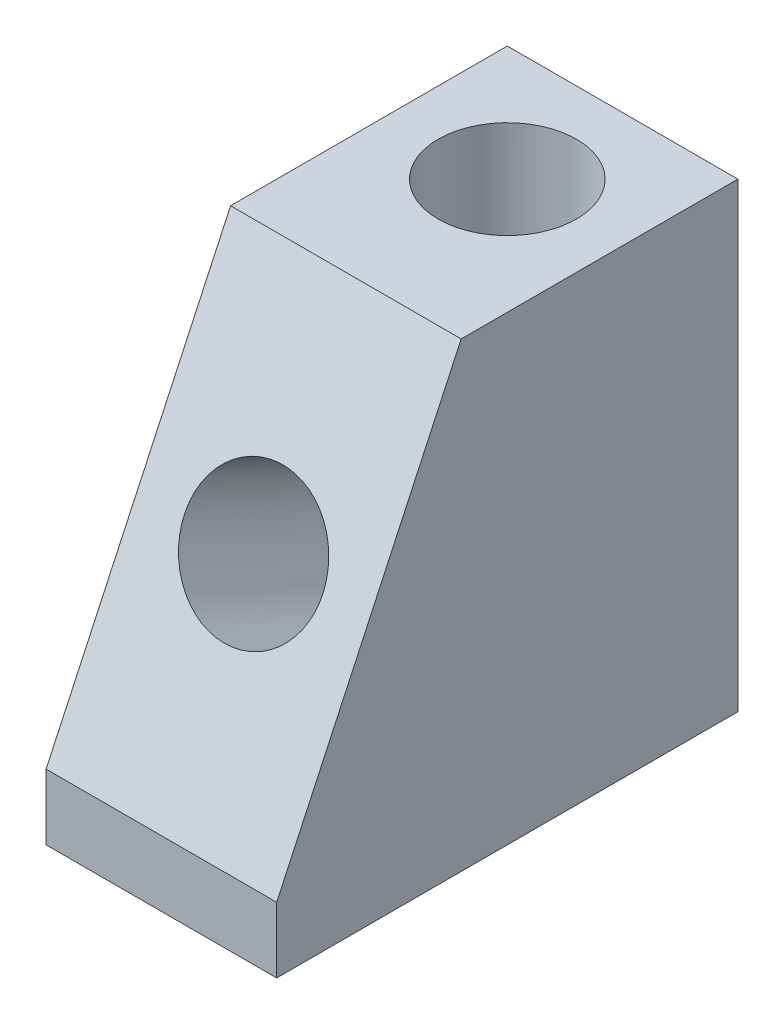
ISO-10303-21;
HEADER;
FILE_DESCRIPTION(('STEP AP214'),'2;1');
FILE_NAME('part.step','',(''),(''),'','','');
FILE_SCHEMA(('AUTOMOTIVE_DESIGN { 1 0 10303 214 1 1 1 1 }'));
ENDSEC;
DATA;
#1=APPLICATION_CONTEXT('core data for automotive mechanical design processes');
#2=APPLICATION_PROTOCOL_DEFINITION('international standard','automotive_design',2000,#1);
#3=PRODUCT_CONTEXT('',#1,'mechanical');
#4=PRODUCT('Part','Part','',(#3));
#5=PRODUCT_RELATED_PRODUCT_CATEGORY('part','',(#4));
#6=PRODUCT_DEFINITION_FORMATION('','',#4);
#7=PRODUCT_DEFINITION_CONTEXT('part definition',#1,'design');
#8=PRODUCT_DEFINITION('design','',#6,#7);
#9=PRODUCT_DEFINITION_SHAPE('','',#8);
#10=(LENGTH_UNIT() NAMED_UNIT(*) SI_UNIT(.MILLI.,.METRE.));
#11=(NAMED_UNIT(*) PLANE_ANGLE_UNIT() SI_UNIT($,.RADIAN.));
#12=(NAMED_UNIT(*) SI_UNIT($,.STERADIAN.) SOLID_ANGLE_UNIT());
#13=UNCERTAINTY_MEASURE_WITH_UNIT(LENGTH_MEASURE(1.E-05),#10,'distance_accuracy_value','');
#14=(GEOMETRIC_REPRESENTATION_CONTEXT(3) GLOBAL_UNCERTAINTY_ASSIGNED_CONTEXT((#13)) GLOBAL_UNIT_ASSIGNED_CONTEXT((#10,
#11,#12)) REPRESENTATION_CONTEXT('',''));
#15=CARTESIAN_POINT('',(0.,0.,0.));
#16=DIRECTION('',(0.,0.,1.));
#17=DIRECTION('',(1.,0.,0.));
#18=AXIS2_PLACEMENT_3D('',#15,#16,#17);
#19=CARTESIAN_POINT('',(2.5,10.,-7.5));
#20=DIRECTION('',(0.,-1.,0.));
#21=DIRECTION('',(0.,0.,-1.));
#22=AXIS2_PLACEMENT_3D('',#19,#20,#21);
#23=CYLINDRICAL_SURFACE('',#22,1.5);
#24=CARTESIAN_POINT('',(2.5,3.14629403912838,-7.5));
#25=DIRECTION('',(0.,-0.537299608346825,0.843391445812885));
#26=DIRECTION('',(0.,-0.843391445812885,-0.537299608346825));
#27=AXIS2_PLACEMENT_3D('',#24,#25,#26);
#28=ELLIPSE('',#27,2.79173849505536,1.5);
#29=CARTESIAN_POINT('',(1.,3.14629403912838,-7.5));
#30=VERTEX_POINT('',#29);
#31=CARTESIAN_POINT('',(4.,3.14629403912838,-7.5));
#32=VERTEX_POINT('',#31);
#33=EDGE_CURVE('E102',#30,#32,#28,.F.);
#34=ORIENTED_EDGE('',*,*,#33,.F.);
#35=CARTESIAN_POINT('',(2.5,3.14629403912838,-7.5));
#36=DIRECTION('',(0.,-0.843391445812885,-0.537299608346825));
#37=DIRECTION('',(0.,-0.537299608346825,0.843391445812885));
#38=AXIS2_PLACEMENT_3D('',#35,#36,#37);
#39=ELLIPSE('',#38,1.77853357115124,1.5);
#40=EDGE_CURVE('E60',#32,#30,#39,.F.);
#41=ORIENTED_EDGE('',*,*,#40,.F.);
#42=EDGE_LOOP('',(#34,#41));
#43=FACE_BOUND('',#42,.T.);
#44=CARTESIAN_POINT('',(2.5,10.,-7.5));
#45=DIRECTION('',(0.,1.,0.));
#46=DIRECTION('',(0.,0.,1.));
#47=AXIS2_PLACEMENT_3D('',#44,#45,#46);
#48=CIRCLE('',#47,1.5);
#49=CARTESIAN_POINT('',(2.5,10.,-6.));
#50=VERTEX_POINT('',#49);
#51=EDGE_CURVE('E140',#50,#50,#48,.T.);
#52=ORIENTED_EDGE('',*,*,#51,.T.);
#53=EDGE_LOOP('',(#52));
#54=FACE_BOUND('',#53,.T.);
#55=ADVANCED_FACE('F45',(#43,#54),#23,.F.);
#56=CARTESIAN_POINT('',(0.,10.,0.));
#57=DIRECTION('',(0.,-1.,0.));
#58=DIRECTION('',(0.,0.,-1.));
#59=AXIS2_PLACEMENT_3D('',#56,#57,#58);
#60=PLANE('',#59);
#61=DIRECTION('',(0.,0.,1.));
#62=VECTOR('',#61,1.);
#63=CARTESIAN_POINT('',(0.,10.,0.));
#64=LINE('',#63,#62);
#65=CARTESIAN_POINT('',(0.,10.,-10.));
#66=VERTEX_POINT('',#65);
#67=CARTESIAN_POINT('',(0.,10.,-4.));
#68=VERTEX_POINT('',#67);
#69=EDGE_CURVE('E148',#66,#68,#64,.T.);
#70=ORIENTED_EDGE('',*,*,#69,.T.);
#71=DIRECTION('',(1.,0.,0.));
#72=VECTOR('',#71,1.);
#73=CARTESIAN_POINT('',(0.,10.,-4.));
#74=LINE('',#73,#72);
#75=CARTESIAN_POINT('',(5.,10.,-4.));
#76=VERTEX_POINT('',#75);
#77=EDGE_CURVE('E133',#68,#76,#74,.T.);
#78=ORIENTED_EDGE('',*,*,#77,.T.);
#79=DIRECTION('',(0.,0.,-1.));
#80=VECTOR('',#79,1.);
#81=CARTESIAN_POINT('',(5.,10.,0.));
#82=LINE('',#81,#80);
#83=CARTESIAN_POINT('',(5.,10.,-10.));
#84=VERTEX_POINT('',#83);
#85=EDGE_CURVE('E152',#76,#84,#82,.T.);
#86=ORIENTED_EDGE('',*,*,#85,.T.);
#87=DIRECTION('',(-1.,0.,0.));
#88=VECTOR('',#87,1.);
#89=CARTESIAN_POINT('',(0.,10.,-10.));
#90=LINE('',#89,#88);
#91=EDGE_CURVE('E156',#84,#66,#90,.T.);
#92=ORIENTED_EDGE('',*,*,#91,.T.);
#93=EDGE_LOOP('',(#70,#78,#86,#92));
#94=FACE_BOUND('',#93,.T.);
#95=ORIENTED_EDGE('',*,*,#51,.F.);
#96=EDGE_LOOP('',(#95));
#97=FACE_BOUND('',#96,.T.);
#98=ADVANCED_FACE('F201',(#94,#97),#60,.F.);
#99=CARTESIAN_POINT('',(0.,0.,0.));
#100=DIRECTION('',(0.,-1.,0.));
#101=DIRECTION('',(0.,0.,-1.));
#102=AXIS2_PLACEMENT_3D('',#99,#100,#101);
#103=PLANE('',#102);
#104=DIRECTION('',(0.,0.,1.));
#105=VECTOR('',#104,1.);
#106=CARTESIAN_POINT('',(0.,0.,0.));
#107=LINE('',#106,#105);
#108=CARTESIAN_POINT('',(0.,0.,-10.));
#109=VERTEX_POINT('',#108);
#110=CARTESIAN_POINT('',(0.,0.,0.));
#111=VERTEX_POINT('',#110);
#112=EDGE_CURVE('E144',#109,#111,#107,.T.);
#113=ORIENTED_EDGE('',*,*,#112,.F.);
#114=DIRECTION('',(-1.,0.,0.));
#115=VECTOR('',#114,1.);
#116=CARTESIAN_POINT('',(0.,0.,-10.));
#117=LINE('',#116,#115);
#118=CARTESIAN_POINT('',(5.,0.,-10.));
#119=VERTEX_POINT('',#118);
#120=EDGE_CURVE('E153',#119,#109,#117,.T.);
#121=ORIENTED_EDGE('',*,*,#120,.F.);
#122=DIRECTION('',(0.,0.,-1.));
#123=VECTOR('',#122,1.);
#124=CARTESIAN_POINT('',(5.,0.,0.));
#125=LINE('',#124,#123);
#126=CARTESIAN_POINT('',(5.,0.,0.));
#127=VERTEX_POINT('',#126);
#128=EDGE_CURVE('E167',#127,#119,#125,.T.);
#129=ORIENTED_EDGE('',*,*,#128,.F.);
#130=DIRECTION('',(1.,0.,0.));
#131=VECTOR('',#130,1.);
#132=CARTESIAN_POINT('',(0.,0.,0.));
#133=LINE('',#132,#131);
#134=EDGE_CURVE('E163',#111,#127,#133,.T.);
#135=ORIENTED_EDGE('',*,*,#134,.F.);
#136=EDGE_LOOP('',(#113,#121,#129,#135));
#137=FACE_BOUND('',#136,.T.);
#138=CARTESIAN_POINT('',(2.5,0.,-7.5));
#139=DIRECTION('',(0.,1.,0.));
#140=DIRECTION('',(0.,0.,1.));
#141=AXIS2_PLACEMENT_3D('',#138,#139,#140);
#142=CIRCLE('',#141,1.5);
#143=CARTESIAN_POINT('',(2.5,0.,-6.));
#144=VERTEX_POINT('',#143);
#145=EDGE_CURVE('E137',#144,#144,#142,.T.);
#146=ORIENTED_EDGE('',*,*,#145,.T.);
#147=EDGE_LOOP('',(#146));
#148=FACE_BOUND('',#147,.T.);
#149=ADVANCED_FACE('F192',(#137,#148),#103,.T.);
#150=CARTESIAN_POINT('',(0.,10.,0.));
#151=DIRECTION('',(1.,0.,0.));
#152=DIRECTION('',(0.,0.,-1.));
#153=AXIS2_PLACEMENT_3D('',#150,#151,#152);
#154=PLANE('',#153);
#155=DIRECTION('',(0.,-1.,0.));
#156=VECTOR('',#155,1.);
#157=CARTESIAN_POINT('',(0.,10.,0.));
#158=LINE('',#157,#156);
#159=CARTESIAN_POINT('',(0.,1.42197231796171,0.));
#160=VERTEX_POINT('',#159);
#161=EDGE_CURVE('E11',#160,#111,#158,.T.);
#162=ORIENTED_EDGE('',*,*,#161,.F.);
#163=DIRECTION('',(0.,0.906307787036651,-0.422618261740697));
#164=VECTOR('',#163,1.);
#165=CARTESIAN_POINT('',(0.,1.42197231796171,0.));
#166=LINE('',#165,#164);
#167=EDGE_CURVE('E127',#160,#68,#166,.T.);
#168=ORIENTED_EDGE('',*,*,#167,.T.);
#169=ORIENTED_EDGE('',*,*,#69,.F.);
#170=DIRECTION('',(0.,-1.,0.));
#171=VECTOR('',#170,1.);
#172=CARTESIAN_POINT('',(0.,10.,-10.));
#173=LINE('',#172,#171);
#174=EDGE_CURVE('E159',#66,#109,#173,.T.);
#175=ORIENTED_EDGE('',*,*,#174,.T.);
#176=ORIENTED_EDGE('',*,*,#112,.T.);
#177=EDGE_LOOP('',(#162,#168,#169,#175,#176));
#178=FACE_BOUND('',#177,.T.);
#179=ADVANCED_FACE('F47',(#178),#154,.F.);
#180=CARTESIAN_POINT('',(0.,10.,0.));
#181=DIRECTION('',(0.,0.,-1.));
#182=DIRECTION('',(-1.,0.,0.));
#183=AXIS2_PLACEMENT_3D('',#180,#181,#182);
#184=PLANE('',#183);
#185=DIRECTION('',(0.,-1.,0.));
#186=VECTOR('',#185,1.);
#187=CARTESIAN_POINT('',(5.,10.,0.));
#188=LINE('',#187,#186);
#189=CARTESIAN_POINT('',(5.,1.42197231796171,0.));
#190=VERTEX_POINT('',#189);
#191=EDGE_CURVE('E54',#190,#127,#188,.T.);
#192=ORIENTED_EDGE('',*,*,#191,.F.);
#193=DIRECTION('',(1.,0.,0.));
#194=VECTOR('',#193,1.);
#195=CARTESIAN_POINT('',(0.,1.42197231796171,0.));
#196=LINE('',#195,#194);
#197=EDGE_CURVE('E68',#160,#190,#196,.T.);
#198=ORIENTED_EDGE('',*,*,#197,.F.);
#199=ORIENTED_EDGE('',*,*,#161,.T.);
#200=ORIENTED_EDGE('',*,*,#134,.T.);
#201=EDGE_LOOP('',(#192,#198,#199,#200));
#202=FACE_BOUND('',#201,.T.);
#203=ADVANCED_FACE('F187',(#202),#184,.F.);
#204=CARTESIAN_POINT('',(5.,10.,0.));
#205=DIRECTION('',(-1.,0.,0.));
#206=DIRECTION('',(0.,0.,1.));
#207=AXIS2_PLACEMENT_3D('',#204,#205,#206);
#208=PLANE('',#207);
#209=ORIENTED_EDGE('',*,*,#85,.F.);
#210=DIRECTION('',(0.,0.906307787036651,-0.422618261740697));
#211=VECTOR('',#210,1.);
#212=CARTESIAN_POINT('',(5.,1.42197231796171,0.));
#213=LINE('',#212,#211);
#214=EDGE_CURVE('E126',#190,#76,#213,.T.);
#215=ORIENTED_EDGE('',*,*,#214,.F.);
#216=ORIENTED_EDGE('',*,*,#191,.T.);
#217=ORIENTED_EDGE('',*,*,#128,.T.);
#218=DIRECTION('',(0.,-1.,0.));
#219=VECTOR('',#218,1.);
#220=CARTESIAN_POINT('',(5.,10.,-10.));
#221=LINE('',#220,#219);
#222=EDGE_CURVE('E175',#84,#119,#221,.T.);
#223=ORIENTED_EDGE('',*,*,#222,.F.);
#224=EDGE_LOOP('',(#209,#215,#216,#217,#223));
#225=FACE_BOUND('',#224,.T.);
#226=ADVANCED_FACE('F182',(#225),#208,.F.);
#227=CARTESIAN_POINT('',(0.,10.,-10.));
#228=DIRECTION('',(0.,0.,1.));
#229=DIRECTION('',(1.,0.,0.));
#230=AXIS2_PLACEMENT_3D('',#227,#228,#229);
#231=PLANE('',#230);
#232=CARTESIAN_POINT('',(2.5,1.98052489374089,-10.));
#233=DIRECTION('',(0.,0.,1.));
#234=DIRECTION('',(0.,1.,0.));
#235=AXIS2_PLACEMENT_3D('',#232,#233,#234);
#236=ELLIPSE('',#235,1.65506687844374,1.5);
#237=CARTESIAN_POINT('',(2.5,3.63559177218463,-10.));
#238=VERTEX_POINT('',#237);
#239=EDGE_CURVE('E116',#238,#238,#236,.T.);
#240=ORIENTED_EDGE('',*,*,#239,.T.);
#241=EDGE_LOOP('',(#240));
#242=FACE_BOUND('',#241,.T.);
#243=ORIENTED_EDGE('',*,*,#120,.T.);
#244=ORIENTED_EDGE('',*,*,#174,.F.);
#245=ORIENTED_EDGE('',*,*,#91,.F.);
#246=ORIENTED_EDGE('',*,*,#222,.T.);
#247=EDGE_LOOP('',(#243,#244,#245,#246));
#248=FACE_BOUND('',#247,.T.);
#249=ADVANCED_FACE('F196',(#242,#248),#231,.F.);
#250=CARTESIAN_POINT('',(2.5,3.14629403912838,-7.5));
#251=DIRECTION('',(0.,-0.537299608346825,0.843391445812885));
#252=DIRECTION('',(0.,-0.843391445812885,-0.537299608346825));
#253=AXIS2_PLACEMENT_3D('',#250,#251,#252);
#254=ELLIPSE('',#253,2.79173849505536,1.5);
#255=EDGE_CURVE('E106',#30,#32,#254,.T.);
#256=ORIENTED_EDGE('',*,*,#255,.F.);
#257=CARTESIAN_POINT('',(2.5,3.14629403912838,-7.5));
#258=DIRECTION('',(0.,-0.843391445812885,-0.537299608346825));
#259=DIRECTION('',(0.,-0.537299608346825,0.843391445812885));
#260=AXIS2_PLACEMENT_3D('',#257,#258,#259);
#261=ELLIPSE('',#260,1.77853357115124,1.5);
#262=EDGE_CURVE('E99',#32,#30,#261,.T.);
#263=ORIENTED_EDGE('',*,*,#262,.F.);
#264=EDGE_LOOP('',(#256,#263));
#265=FACE_BOUND('',#264,.T.);
#266=ORIENTED_EDGE('',*,*,#145,.F.);
#267=EDGE_LOOP('',(#266));
#268=FACE_BOUND('',#267,.T.);
#269=ADVANCED_FACE('F118',(#265,#268),#23,.F.);
#270=CARTESIAN_POINT('',(0.,1.42197231796171,0.));
#271=DIRECTION('',(0.,-0.422618261740697,-0.906307787036651));
#272=DIRECTION('',(0.,0.906307787036651,-0.422618261740697));
#273=AXIS2_PLACEMENT_3D('',#270,#271,#272);
#274=PLANE('',#273);
#275=CARTESIAN_POINT('',(2.5,5.71098615898086,-2.));
#276=DIRECTION('',(0.,0.422618261740697,0.906307787036651));
#277=DIRECTION('',(0.,-0.906307787036651,0.422618261740697));
#278=AXIS2_PLACEMENT_3D('',#275,#276,#277);
#279=CIRCLE('',#278,1.5);
#280=CARTESIAN_POINT('',(2.5,4.35152447842588,-1.36607260738895));
#281=VERTEX_POINT('',#280);
#282=EDGE_CURVE('E112',#281,#281,#279,.T.);
#283=ORIENTED_EDGE('',*,*,#282,.F.);
#284=EDGE_LOOP('',(#283));
#285=FACE_BOUND('',#284,.T.);
#286=ORIENTED_EDGE('',*,*,#214,.T.);
#287=ORIENTED_EDGE('',*,*,#77,.F.);
#288=ORIENTED_EDGE('',*,*,#167,.F.);
#289=ORIENTED_EDGE('',*,*,#197,.T.);
#290=EDGE_LOOP('',(#286,#287,#288,#289));
#291=FACE_BOUND('',#290,.T.);
#292=ADVANCED_FACE('F203',(#285,#291),#274,.F.);
#293=CARTESIAN_POINT('',(2.5,1.62679087805665,-10.7585850446545));
#294=DIRECTION('',(0.,0.422618261740697,0.906307787036651));
#295=DIRECTION('',(0.,-0.906307787036651,0.422618261740697));
#296=AXIS2_PLACEMENT_3D('',#293,#294,#295);
#297=CYLINDRICAL_SURFACE('',#296,1.5);
#298=ORIENTED_EDGE('',*,*,#33,.T.);
#299=ORIENTED_EDGE('',*,*,#262,.T.);
#300=EDGE_LOOP('',(#298,#299));
#301=FACE_BOUND('',#300,.T.);
#302=ORIENTED_EDGE('',*,*,#282,.T.);
#303=EDGE_LOOP('',(#302));
#304=FACE_BOUND('',#303,.T.);
#305=ADVANCED_FACE('F100',(#301,#304),#297,.F.);
#306=ORIENTED_EDGE('',*,*,#255,.T.);
#307=ORIENTED_EDGE('',*,*,#40,.T.);
#308=EDGE_LOOP('',(#306,#307));
#309=FACE_BOUND('',#308,.T.);
#310=ORIENTED_EDGE('',*,*,#239,.F.);
#311=EDGE_LOOP('',(#310));
#312=FACE_BOUND('',#311,.T.);
#313=ADVANCED_FACE('F109',(#309,#312),#297,.F.);
#314=CLOSED_SHELL('',(#55,#98,#149,#179,#203,#226,#249,#269,#292,#305,#313));
#315=MANIFOLD_SOLID_BREP('B2',#314);
#316=ADVANCED_BREP_SHAPE_REPRESENTATION('',(#18,#315),#14);
#317=SHAPE_DEFINITION_REPRESENTATION(#9,#316);
ENDSEC;
END-ISO-10303-21;
